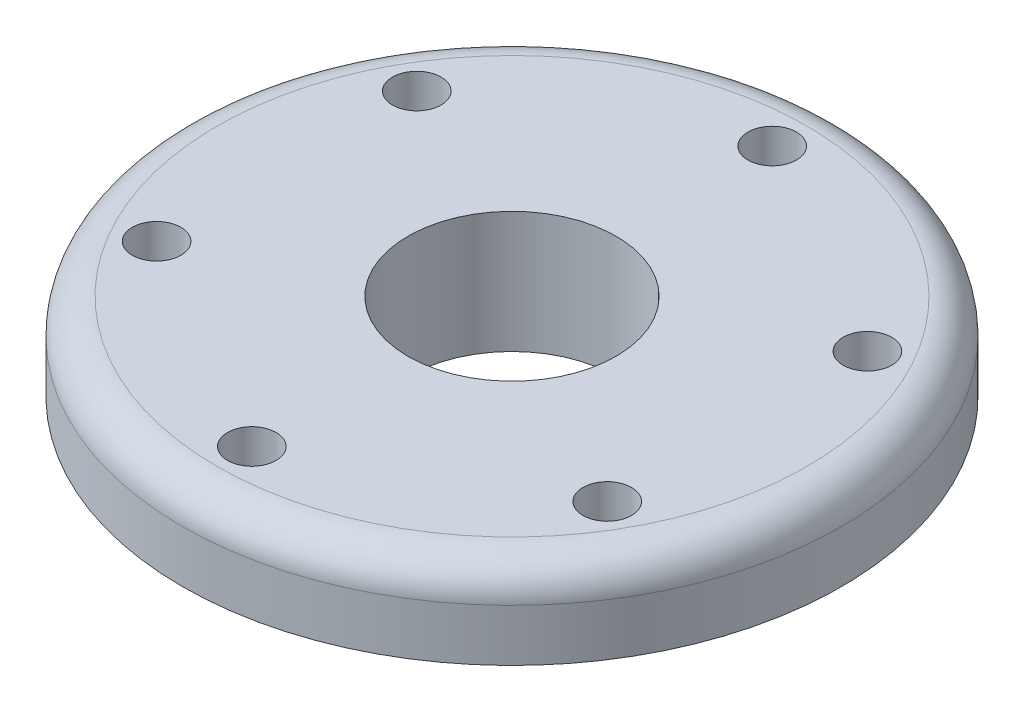
ISO-10303-21;
HEADER;
FILE_DESCRIPTION(('STEP AP214'),'2;1');
FILE_NAME('part.step','',(''),(''),'','','');
FILE_SCHEMA(('AUTOMOTIVE_DESIGN { 1 0 10303 214 1 1 1 1 }'));
ENDSEC;
DATA;
#1=APPLICATION_CONTEXT('core data for automotive mechanical design processes');
#2=APPLICATION_PROTOCOL_DEFINITION('international standard','automotive_design',2000,#1);
#3=PRODUCT_CONTEXT('',#1,'mechanical');
#4=PRODUCT('Part','Part','',(#3));
#5=PRODUCT_RELATED_PRODUCT_CATEGORY('part','',(#4));
#6=PRODUCT_DEFINITION_FORMATION('','',#4);
#7=PRODUCT_DEFINITION_CONTEXT('part definition',#1,'design');
#8=PRODUCT_DEFINITION('design','',#6,#7);
#9=PRODUCT_DEFINITION_SHAPE('','',#8);
#10=(LENGTH_UNIT() NAMED_UNIT(*) SI_UNIT(.MILLI.,.METRE.));
#11=(NAMED_UNIT(*) PLANE_ANGLE_UNIT() SI_UNIT($,.RADIAN.));
#12=(NAMED_UNIT(*) SI_UNIT($,.STERADIAN.) SOLID_ANGLE_UNIT());
#13=UNCERTAINTY_MEASURE_WITH_UNIT(LENGTH_MEASURE(1.E-05),#10,'distance_accuracy_value','');
#14=(GEOMETRIC_REPRESENTATION_CONTEXT(3) GLOBAL_UNCERTAINTY_ASSIGNED_CONTEXT((#13)) GLOBAL_UNIT_ASSIGNED_CONTEXT((#10,
#11,#12)) REPRESENTATION_CONTEXT('',''));
#15=CARTESIAN_POINT('',(0.,0.,0.));
#16=DIRECTION('',(0.,0.,1.));
#17=DIRECTION('',(1.,0.,0.));
#18=AXIS2_PLACEMENT_3D('',#15,#16,#17);
#19=CARTESIAN_POINT('',(0.,2.,0.));
#20=DIRECTION('',(0.,-1.,0.));
#21=DIRECTION('',(0.,0.,-1.));
#22=AXIS2_PLACEMENT_3D('',#19,#20,#21);
#23=CYLINDRICAL_SURFACE('',#22,12.);
#24=CARTESIAN_POINT('',(0.,2.,0.));
#25=DIRECTION('',(0.,1.,0.));
#26=DIRECTION('',(0.,0.,1.));
#27=AXIS2_PLACEMENT_3D('',#24,#25,#26);
#28=CIRCLE('',#27,12.);
#29=CARTESIAN_POINT('',(0.,2.,12.));
#30=VERTEX_POINT('',#29);
#31=EDGE_CURVE('E56',#30,#30,#28,.T.);
#32=ORIENTED_EDGE('',*,*,#31,.F.);
#33=EDGE_LOOP('',(#32));
#34=FACE_BOUND('',#33,.T.);
#35=CARTESIAN_POINT('',(0.,0.,0.));
#36=DIRECTION('',(0.,1.,0.));
#37=DIRECTION('',(0.,0.,1.));
#38=AXIS2_PLACEMENT_3D('',#35,#36,#37);
#39=CIRCLE('',#38,12.);
#40=CARTESIAN_POINT('',(0.,0.,12.));
#41=VERTEX_POINT('',#40);
#42=EDGE_CURVE('E88',#41,#41,#39,.T.);
#43=ORIENTED_EDGE('',*,*,#42,.T.);
#44=EDGE_LOOP('',(#43));
#45=FACE_BOUND('',#44,.T.);
#46=ADVANCED_FACE('F41',(#34,#45),#23,.T.);
#47=CARTESIAN_POINT('',(0.,0.,0.));
#48=DIRECTION('',(0.,1.,0.));
#49=DIRECTION('',(0.,0.,1.));
#50=AXIS2_PLACEMENT_3D('',#47,#48,#49);
#51=PLANE('',#50);
#52=CARTESIAN_POINT('',(0.,0.,0.));
#53=DIRECTION('',(0.,1.,0.));
#54=DIRECTION('',(0.,0.,1.));
#55=AXIS2_PLACEMENT_3D('',#52,#53,#54);
#56=CIRCLE('',#55,6.);
#57=CARTESIAN_POINT('',(0.,0.,6.));
#58=VERTEX_POINT('',#57);
#59=EDGE_CURVE('E65',#58,#58,#56,.T.);
#60=ORIENTED_EDGE('',*,*,#59,.T.);
#61=EDGE_LOOP('',(#60));
#62=FACE_BOUND('',#61,.T.);
#63=ORIENTED_EDGE('',*,*,#42,.F.);
#64=EDGE_LOOP('',(#63));
#65=FACE_BOUND('',#64,.T.);
#66=ADVANCED_FACE('F107',(#62,#65),#51,.F.);
#67=CARTESIAN_POINT('',(0.,7.,0.));
#68=DIRECTION('',(0.,-1.,0.));
#69=DIRECTION('',(0.,0.,-1.));
#70=AXIS2_PLACEMENT_3D('',#67,#68,#69);
#71=CYLINDRICAL_SURFACE('',#70,19.);
#72=CARTESIAN_POINT('',(0.,5.,0.));
#73=DIRECTION('',(0.,1.,0.));
#74=DIRECTION('',(0.,0.,1.));
#75=AXIS2_PLACEMENT_3D('',#72,#73,#74);
#76=CIRCLE('',#75,19.);
#77=CARTESIAN_POINT('',(0.,5.,19.));
#78=VERTEX_POINT('',#77);
#79=EDGE_CURVE('E10',#78,#78,#76,.F.);
#80=ORIENTED_EDGE('',*,*,#79,.T.);
#81=EDGE_LOOP('',(#80));
#82=FACE_BOUND('',#81,.T.);
#83=CARTESIAN_POINT('',(0.,2.,0.));
#84=DIRECTION('',(0.,1.,0.));
#85=DIRECTION('',(0.,0.,1.));
#86=AXIS2_PLACEMENT_3D('',#83,#84,#85);
#87=CIRCLE('',#86,19.);
#88=CARTESIAN_POINT('',(0.,2.,19.));
#89=VERTEX_POINT('',#88);
#90=EDGE_CURVE('E83',#89,#89,#87,.T.);
#91=ORIENTED_EDGE('',*,*,#90,.T.);
#92=EDGE_LOOP('',(#91));
#93=FACE_BOUND('',#92,.T.);
#94=ADVANCED_FACE('F111',(#82,#93),#71,.T.);
#95=CARTESIAN_POINT('',(0.,7.,0.));
#96=DIRECTION('',(0.,1.,0.));
#97=DIRECTION('',(0.,0.,1.));
#98=AXIS2_PLACEMENT_3D('',#95,#96,#97);
#99=PLANE('',#98);
#100=CARTESIAN_POINT('',(-12.9903810567666,7.,-7.49999999999999));
#101=DIRECTION('',(0.,1.,0.));
#102=DIRECTION('',(0.,0.,1.));
#103=AXIS2_PLACEMENT_3D('',#100,#101,#102);
#104=CIRCLE('',#103,1.40000000000018);
#105=CARTESIAN_POINT('',(-12.9903810567666,7.,-6.09999999999981));
#106=VERTEX_POINT('',#105);
#107=EDGE_CURVE('E185',#106,#106,#104,.T.);
#108=ORIENTED_EDGE('',*,*,#107,.F.);
#109=EDGE_LOOP('',(#108));
#110=FACE_BOUND('',#109,.T.);
#111=CARTESIAN_POINT('',(-12.9903810567666,7.,7.50000000000001));
#112=DIRECTION('',(0.,1.,0.));
#113=DIRECTION('',(0.,0.,1.));
#114=AXIS2_PLACEMENT_3D('',#111,#112,#113);
#115=CIRCLE('',#114,1.40000000000014);
#116=CARTESIAN_POINT('',(-12.9903810567666,7.,8.90000000000015));
#117=VERTEX_POINT('',#116);
#118=EDGE_CURVE('E181',#117,#117,#115,.T.);
#119=ORIENTED_EDGE('',*,*,#118,.F.);
#120=EDGE_LOOP('',(#119));
#121=FACE_BOUND('',#120,.T.);
#122=CARTESIAN_POINT('',(0.,7.,15.));
#123=DIRECTION('',(0.,1.,0.));
#124=DIRECTION('',(0.,0.,1.));
#125=AXIS2_PLACEMENT_3D('',#122,#123,#124);
#126=CIRCLE('',#125,1.4000000000001);
#127=CARTESIAN_POINT('',(0.,7.,16.4000000000001));
#128=VERTEX_POINT('',#127);
#129=EDGE_CURVE('E177',#128,#128,#126,.T.);
#130=ORIENTED_EDGE('',*,*,#129,.F.);
#131=EDGE_LOOP('',(#130));
#132=FACE_BOUND('',#131,.T.);
#133=CARTESIAN_POINT('',(12.9903810567666,7.,7.5));
#134=DIRECTION('',(0.,1.,0.));
#135=DIRECTION('',(0.,0.,1.));
#136=AXIS2_PLACEMENT_3D('',#133,#134,#135);
#137=CIRCLE('',#136,1.40000000000007);
#138=CARTESIAN_POINT('',(12.9903810567666,7.,8.90000000000007));
#139=VERTEX_POINT('',#138);
#140=EDGE_CURVE('E171',#139,#139,#137,.T.);
#141=ORIENTED_EDGE('',*,*,#140,.F.);
#142=EDGE_LOOP('',(#141));
#143=FACE_BOUND('',#142,.T.);
#144=CARTESIAN_POINT('',(12.9903810567666,7.,-7.5));
#145=DIRECTION('',(0.,1.,0.));
#146=DIRECTION('',(0.,0.,1.));
#147=AXIS2_PLACEMENT_3D('',#144,#145,#146);
#148=CIRCLE('',#147,1.40000000000004);
#149=CARTESIAN_POINT('',(12.9903810567666,7.,-6.09999999999997));
#150=VERTEX_POINT('',#149);
#151=EDGE_CURVE('E165',#150,#150,#148,.T.);
#152=ORIENTED_EDGE('',*,*,#151,.F.);
#153=EDGE_LOOP('',(#152));
#154=FACE_BOUND('',#153,.T.);
#155=CARTESIAN_POINT('',(0.,7.,-15.));
#156=DIRECTION('',(0.,1.,0.));
#157=DIRECTION('',(0.,0.,1.));
#158=AXIS2_PLACEMENT_3D('',#155,#156,#157);
#159=CIRCLE('',#158,1.4);
#160=CARTESIAN_POINT('',(0.,7.,-13.6));
#161=VERTEX_POINT('',#160);
#162=EDGE_CURVE('E160',#161,#161,#159,.T.);
#163=ORIENTED_EDGE('',*,*,#162,.F.);
#164=EDGE_LOOP('',(#163));
#165=FACE_BOUND('',#164,.T.);
#166=CARTESIAN_POINT('',(0.,7.,0.));
#167=DIRECTION('',(0.,1.,0.));
#168=DIRECTION('',(0.,0.,1.));
#169=AXIS2_PLACEMENT_3D('',#166,#167,#168);
#170=CIRCLE('',#169,6.);
#171=CARTESIAN_POINT('',(0.,7.,6.));
#172=VERTEX_POINT('',#171);
#173=EDGE_CURVE('E96',#172,#172,#170,.T.);
#174=ORIENTED_EDGE('',*,*,#173,.F.);
#175=EDGE_LOOP('',(#174));
#176=FACE_BOUND('',#175,.T.);
#177=CARTESIAN_POINT('',(0.,7.,0.));
#178=DIRECTION('',(0.,1.,0.));
#179=DIRECTION('',(0.,0.,1.));
#180=AXIS2_PLACEMENT_3D('',#177,#178,#179);
#181=CIRCLE('',#180,17.);
#182=CARTESIAN_POINT('',(0.,7.,17.));
#183=VERTEX_POINT('',#182);
#184=EDGE_CURVE('E50',#183,#183,#181,.T.);
#185=ORIENTED_EDGE('',*,*,#184,.T.);
#186=EDGE_LOOP('',(#185));
#187=FACE_BOUND('',#186,.T.);
#188=ADVANCED_FACE('F117',(#110,#121,#132,#143,#154,#165,#176,#187),#99,.T.);
#189=CARTESIAN_POINT('',(0.,2.,0.));
#190=DIRECTION('',(0.,1.,0.));
#191=DIRECTION('',(0.,0.,1.));
#192=AXIS2_PLACEMENT_3D('',#189,#190,#191);
#193=PLANE('',#192);
#194=CARTESIAN_POINT('',(-12.9903810567666,2.,-7.49999999999999));
#195=DIRECTION('',(0.,1.,0.));
#196=DIRECTION('',(0.,0.,1.));
#197=AXIS2_PLACEMENT_3D('',#194,#195,#196);
#198=CIRCLE('',#197,1.40000000000018);
#199=CARTESIAN_POINT('',(-12.9903810567666,2.,-6.09999999999981));
#200=VERTEX_POINT('',#199);
#201=EDGE_CURVE('E45',#200,#200,#198,.T.);
#202=ORIENTED_EDGE('',*,*,#201,.T.);
#203=EDGE_LOOP('',(#202));
#204=FACE_BOUND('',#203,.T.);
#205=CARTESIAN_POINT('',(-12.9903810567666,2.,7.50000000000001));
#206=DIRECTION('',(0.,1.,0.));
#207=DIRECTION('',(0.,0.,1.));
#208=AXIS2_PLACEMENT_3D('',#205,#206,#207);
#209=CIRCLE('',#208,1.40000000000014);
#210=CARTESIAN_POINT('',(-12.9903810567666,2.,8.90000000000015));
#211=VERTEX_POINT('',#210);
#212=EDGE_CURVE('E76',#211,#211,#209,.T.);
#213=ORIENTED_EDGE('',*,*,#212,.T.);
#214=EDGE_LOOP('',(#213));
#215=FACE_BOUND('',#214,.T.);
#216=CARTESIAN_POINT('',(0.,2.,15.));
#217=DIRECTION('',(0.,1.,0.));
#218=DIRECTION('',(0.,0.,1.));
#219=AXIS2_PLACEMENT_3D('',#216,#217,#218);
#220=CIRCLE('',#219,1.4000000000001);
#221=CARTESIAN_POINT('',(0.,2.,16.4000000000001));
#222=VERTEX_POINT('',#221);
#223=EDGE_CURVE('E73',#222,#222,#220,.T.);
#224=ORIENTED_EDGE('',*,*,#223,.T.);
#225=EDGE_LOOP('',(#224));
#226=FACE_BOUND('',#225,.T.);
#227=CARTESIAN_POINT('',(12.9903810567666,2.,7.5));
#228=DIRECTION('',(0.,1.,0.));
#229=DIRECTION('',(0.,0.,1.));
#230=AXIS2_PLACEMENT_3D('',#227,#228,#229);
#231=CIRCLE('',#230,1.40000000000007);
#232=CARTESIAN_POINT('',(12.9903810567666,2.,8.90000000000007));
#233=VERTEX_POINT('',#232);
#234=EDGE_CURVE('E69',#233,#233,#231,.T.);
#235=ORIENTED_EDGE('',*,*,#234,.T.);
#236=EDGE_LOOP('',(#235));
#237=FACE_BOUND('',#236,.T.);
#238=CARTESIAN_POINT('',(12.9903810567666,2.,-7.5));
#239=DIRECTION('',(0.,1.,0.));
#240=DIRECTION('',(0.,0.,1.));
#241=AXIS2_PLACEMENT_3D('',#238,#239,#240);
#242=CIRCLE('',#241,1.40000000000004);
#243=CARTESIAN_POINT('',(12.9903810567666,2.,-6.09999999999997));
#244=VERTEX_POINT('',#243);
#245=EDGE_CURVE('E64',#244,#244,#242,.T.);
#246=ORIENTED_EDGE('',*,*,#245,.T.);
#247=EDGE_LOOP('',(#246));
#248=FACE_BOUND('',#247,.T.);
#249=CARTESIAN_POINT('',(0.,2.,-15.));
#250=DIRECTION('',(0.,1.,0.));
#251=DIRECTION('',(0.,0.,1.));
#252=AXIS2_PLACEMENT_3D('',#249,#250,#251);
#253=CIRCLE('',#252,1.4);
#254=CARTESIAN_POINT('',(0.,2.,-13.6));
#255=VERTEX_POINT('',#254);
#256=EDGE_CURVE('E60',#255,#255,#253,.T.);
#257=ORIENTED_EDGE('',*,*,#256,.T.);
#258=EDGE_LOOP('',(#257));
#259=FACE_BOUND('',#258,.T.);
#260=ORIENTED_EDGE('',*,*,#31,.T.);
#261=EDGE_LOOP('',(#260));
#262=FACE_BOUND('',#261,.T.);
#263=ORIENTED_EDGE('',*,*,#90,.F.);
#264=EDGE_LOOP('',(#263));
#265=FACE_BOUND('',#264,.T.);
#266=ADVANCED_FACE('F102',(#204,#215,#226,#237,#248,#259,#262,#265),#193,.F.);
#267=CARTESIAN_POINT('',(0.,5.,0.));
#268=DIRECTION('',(0.,1.,0.));
#269=DIRECTION('',(0.,0.,1.));
#270=AXIS2_PLACEMENT_3D('',#267,#268,#269);
#271=TOROIDAL_SURFACE('',#270,17.,2.);
#272=ORIENTED_EDGE('',*,*,#79,.F.);
#273=EDGE_LOOP('',(#272));
#274=FACE_BOUND('',#273,.T.);
#275=ORIENTED_EDGE('',*,*,#184,.F.);
#276=EDGE_LOOP('',(#275));
#277=FACE_BOUND('',#276,.T.);
#278=ADVANCED_FACE('F43',(#274,#277),#271,.T.);
#279=CARTESIAN_POINT('',(0.,0.,-15.));
#280=DIRECTION('',(0.,1.,0.));
#281=DIRECTION('',(0.,0.,1.));
#282=AXIS2_PLACEMENT_3D('',#279,#280,#281);
#283=CYLINDRICAL_SURFACE('',#282,1.4);
#284=ORIENTED_EDGE('',*,*,#162,.T.);
#285=EDGE_LOOP('',(#284));
#286=FACE_BOUND('',#285,.T.);
#287=ORIENTED_EDGE('',*,*,#256,.F.);
#288=EDGE_LOOP('',(#287));
#289=FACE_BOUND('',#288,.T.);
#290=ADVANCED_FACE('F149',(#286,#289),#283,.F.);
#291=CARTESIAN_POINT('',(12.9903810567666,0.,-7.5));
#292=DIRECTION('',(0.,1.,0.));
#293=DIRECTION('',(0.,0.,1.));
#294=AXIS2_PLACEMENT_3D('',#291,#292,#293);
#295=CYLINDRICAL_SURFACE('',#294,1.40000000000004);
#296=ORIENTED_EDGE('',*,*,#151,.T.);
#297=EDGE_LOOP('',(#296));
#298=FACE_BOUND('',#297,.T.);
#299=ORIENTED_EDGE('',*,*,#245,.F.);
#300=EDGE_LOOP('',(#299));
#301=FACE_BOUND('',#300,.T.);
#302=ADVANCED_FACE('F145',(#298,#301),#295,.F.);
#303=CARTESIAN_POINT('',(12.9903810567666,0.,7.5));
#304=DIRECTION('',(0.,1.,0.));
#305=DIRECTION('',(0.,0.,1.));
#306=AXIS2_PLACEMENT_3D('',#303,#304,#305);
#307=CYLINDRICAL_SURFACE('',#306,1.40000000000007);
#308=ORIENTED_EDGE('',*,*,#140,.T.);
#309=EDGE_LOOP('',(#308));
#310=FACE_BOUND('',#309,.T.);
#311=ORIENTED_EDGE('',*,*,#234,.F.);
#312=EDGE_LOOP('',(#311));
#313=FACE_BOUND('',#312,.T.);
#314=ADVANCED_FACE('F141',(#310,#313),#307,.F.);
#315=CARTESIAN_POINT('',(0.,0.,15.));
#316=DIRECTION('',(0.,1.,0.));
#317=DIRECTION('',(0.,0.,1.));
#318=AXIS2_PLACEMENT_3D('',#315,#316,#317);
#319=CYLINDRICAL_SURFACE('',#318,1.4000000000001);
#320=ORIENTED_EDGE('',*,*,#129,.T.);
#321=EDGE_LOOP('',(#320));
#322=FACE_BOUND('',#321,.T.);
#323=ORIENTED_EDGE('',*,*,#223,.F.);
#324=EDGE_LOOP('',(#323));
#325=FACE_BOUND('',#324,.T.);
#326=ADVANCED_FACE('F137',(#322,#325),#319,.F.);
#327=CARTESIAN_POINT('',(-12.9903810567666,0.,7.50000000000001));
#328=DIRECTION('',(0.,1.,0.));
#329=DIRECTION('',(0.,0.,1.));
#330=AXIS2_PLACEMENT_3D('',#327,#328,#329);
#331=CYLINDRICAL_SURFACE('',#330,1.40000000000014);
#332=ORIENTED_EDGE('',*,*,#118,.T.);
#333=EDGE_LOOP('',(#332));
#334=FACE_BOUND('',#333,.T.);
#335=ORIENTED_EDGE('',*,*,#212,.F.);
#336=EDGE_LOOP('',(#335));
#337=FACE_BOUND('',#336,.T.);
#338=ADVANCED_FACE('F133',(#334,#337),#331,.F.);
#339=CARTESIAN_POINT('',(-12.9903810567666,0.,-7.49999999999999));
#340=DIRECTION('',(0.,1.,0.));
#341=DIRECTION('',(0.,0.,1.));
#342=AXIS2_PLACEMENT_3D('',#339,#340,#341);
#343=CYLINDRICAL_SURFACE('',#342,1.40000000000018);
#344=ORIENTED_EDGE('',*,*,#107,.T.);
#345=EDGE_LOOP('',(#344));
#346=FACE_BOUND('',#345,.T.);
#347=ORIENTED_EDGE('',*,*,#201,.F.);
#348=EDGE_LOOP('',(#347));
#349=FACE_BOUND('',#348,.T.);
#350=ADVANCED_FACE('F129',(#346,#349),#343,.F.);
#351=CARTESIAN_POINT('',(0.,0.,0.));
#352=DIRECTION('',(0.,1.,0.));
#353=DIRECTION('',(0.,0.,1.));
#354=AXIS2_PLACEMENT_3D('',#351,#352,#353);
#355=CYLINDRICAL_SURFACE('',#354,6.);
#356=ORIENTED_EDGE('',*,*,#59,.F.);
#357=EDGE_LOOP('',(#356));
#358=FACE_BOUND('',#357,.T.);
#359=ORIENTED_EDGE('',*,*,#173,.T.);
#360=EDGE_LOOP('',(#359));
#361=FACE_BOUND('',#360,.T.);
#362=ADVANCED_FACE('F126',(#358,#361),#355,.F.);
#363=CLOSED_SHELL('',(#46,#66,#94,#188,#266,#278,#290,#302,#314,#326,#338,#350,#362));
#364=MANIFOLD_SOLID_BREP('B2',#363);
#365=ADVANCED_BREP_SHAPE_REPRESENTATION('',(#18,#364),#14);
#366=SHAPE_DEFINITION_REPRESENTATION(#9,#365);
ENDSEC;
END-ISO-10303-21;
